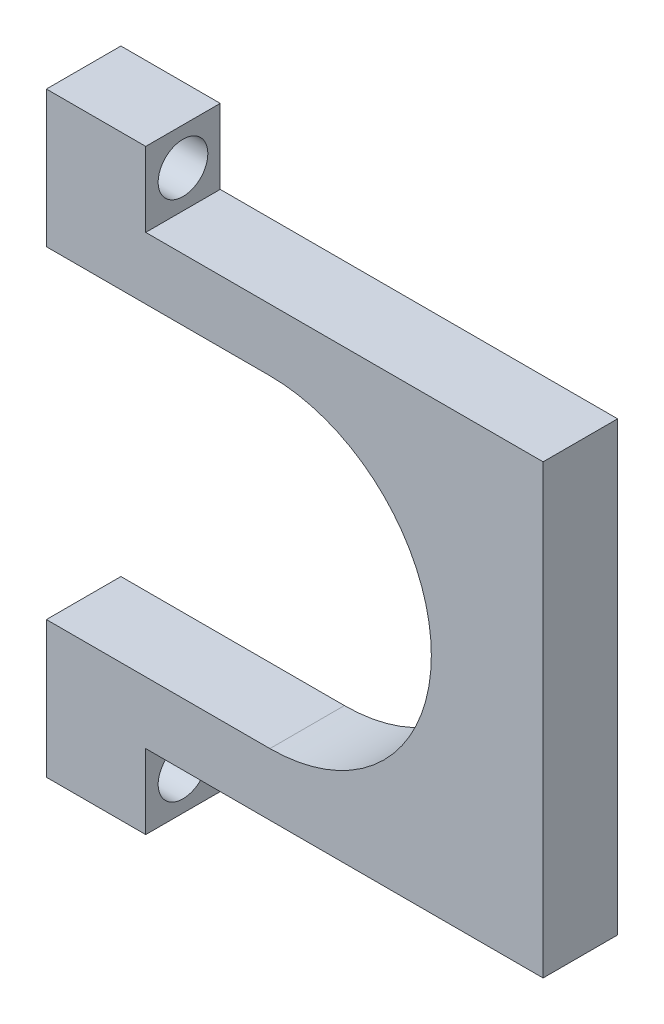
ISO-10303-21;
HEADER;
FILE_DESCRIPTION(('STEP AP214'),'2;1');
FILE_NAME('part.step','',(''),(''),'','','');
FILE_SCHEMA(('AUTOMOTIVE_DESIGN { 1 0 10303 214 1 1 1 1 }'));
ENDSEC;
DATA;
#1=APPLICATION_CONTEXT('core data for automotive mechanical design processes');
#2=APPLICATION_PROTOCOL_DEFINITION('international standard','automotive_design',2000,#1);
#3=PRODUCT_CONTEXT('',#1,'mechanical');
#4=PRODUCT('Part','Part','',(#3));
#5=PRODUCT_RELATED_PRODUCT_CATEGORY('part','',(#4));
#6=PRODUCT_DEFINITION_FORMATION('','',#4);
#7=PRODUCT_DEFINITION_CONTEXT('part definition',#1,'design');
#8=PRODUCT_DEFINITION('design','',#6,#7);
#9=PRODUCT_DEFINITION_SHAPE('','',#8);
#10=(LENGTH_UNIT() NAMED_UNIT(*) SI_UNIT(.MILLI.,.METRE.));
#11=(NAMED_UNIT(*) PLANE_ANGLE_UNIT() SI_UNIT($,.RADIAN.));
#12=(NAMED_UNIT(*) SI_UNIT($,.STERADIAN.) SOLID_ANGLE_UNIT());
#13=UNCERTAINTY_MEASURE_WITH_UNIT(LENGTH_MEASURE(1.E-05),#10,'distance_accuracy_value','');
#14=(GEOMETRIC_REPRESENTATION_CONTEXT(3) GLOBAL_UNCERTAINTY_ASSIGNED_CONTEXT((#13)) GLOBAL_UNIT_ASSIGNED_CONTEXT((#10,
#11,#12)) REPRESENTATION_CONTEXT('',''));
#15=CARTESIAN_POINT('',(0.,0.,0.));
#16=DIRECTION('',(0.,0.,1.));
#17=DIRECTION('',(1.,0.,0.));
#18=AXIS2_PLACEMENT_3D('',#15,#16,#17);
#19=CARTESIAN_POINT('',(-11.5569823434992,5.6661316211878,-3.));
#20=DIRECTION('',(-1.,0.,0.));
#21=DIRECTION('',(0.,0.,1.));
#22=AXIS2_PLACEMENT_3D('',#19,#20,#21);
#23=PLANE('',#22);
#24=CARTESIAN_POINT('',(-11.5569823434992,7.1661316211878,-1.5));
#25=DIRECTION('',(1.,0.,0.));
#26=DIRECTION('',(0.,0.,-1.));
#27=AXIS2_PLACEMENT_3D('',#24,#25,#26);
#28=CIRCLE('',#27,1.);
#29=CARTESIAN_POINT('',(-11.5569823434992,7.1661316211878,-2.5));
#30=VERTEX_POINT('',#29);
#31=EDGE_CURVE('E150',#30,#30,#28,.T.);
#32=ORIENTED_EDGE('',*,*,#31,.T.);
#33=EDGE_LOOP('',(#32));
#34=FACE_BOUND('',#33,.T.);
#35=DIRECTION('',(0.,-1.,0.));
#36=VECTOR('',#35,1.);
#37=CARTESIAN_POINT('',(-11.5569823434992,5.6661316211878,0.));
#38=LINE('',#37,#36);
#39=CARTESIAN_POINT('',(-11.5569823434992,8.6661316211878,0.));
#40=VERTEX_POINT('',#39);
#41=CARTESIAN_POINT('',(-11.5569823434992,3.1661316211878,0.));
#42=VERTEX_POINT('',#41);
#43=EDGE_CURVE('E207',#40,#42,#38,.T.);
#44=ORIENTED_EDGE('',*,*,#43,.F.);
#45=DIRECTION('',(0.,0.,1.));
#46=VECTOR('',#45,1.);
#47=CARTESIAN_POINT('',(-11.5569823434992,8.6661316211878,-3.));
#48=LINE('',#47,#46);
#49=CARTESIAN_POINT('',(-11.5569823434992,8.6661316211878,-3.));
#50=VERTEX_POINT('',#49);
#51=EDGE_CURVE('E161',#50,#40,#48,.T.);
#52=ORIENTED_EDGE('',*,*,#51,.F.);
#53=DIRECTION('',(0.,-1.,0.));
#54=VECTOR('',#53,1.);
#55=CARTESIAN_POINT('',(-11.5569823434992,5.6661316211878,-3.));
#56=LINE('',#55,#54);
#57=CARTESIAN_POINT('',(-11.5569823434992,3.1661316211878,-3.));
#58=VERTEX_POINT('',#57);
#59=EDGE_CURVE('E191',#50,#58,#56,.T.);
#60=ORIENTED_EDGE('',*,*,#59,.T.);
#61=DIRECTION('',(0.,0.,1.));
#62=VECTOR('',#61,1.);
#63=CARTESIAN_POINT('',(-11.5569823434992,3.1661316211878,-3.));
#64=LINE('',#63,#62);
#65=EDGE_CURVE('E248',#58,#42,#64,.T.);
#66=ORIENTED_EDGE('',*,*,#65,.T.);
#67=EDGE_LOOP('',(#44,#52,#60,#66));
#68=FACE_BOUND('',#67,.T.);
#69=ADVANCED_FACE('F33',(#34,#68),#23,.T.);
#70=CARTESIAN_POINT('',(-11.5569823434992,5.6661316211878,-3.));
#71=DIRECTION('',(0.,1.,0.));
#72=DIRECTION('',(0.,0.,1.));
#73=AXIS2_PLACEMENT_3D('',#70,#71,#72);
#74=PLANE('',#73);
#75=DIRECTION('',(0.,0.,-1.));
#76=VECTOR('',#75,1.);
#77=CARTESIAN_POINT('',(-7.55698234349919,5.6661316211878,-3.));
#78=LINE('',#77,#76);
#79=CARTESIAN_POINT('',(-7.55698234349919,5.6661316211878,0.));
#80=VERTEX_POINT('',#79);
#81=CARTESIAN_POINT('',(-7.55698234349919,5.6661316211878,-3.));
#82=VERTEX_POINT('',#81);
#83=EDGE_CURVE('E57',#80,#82,#78,.T.);
#84=ORIENTED_EDGE('',*,*,#83,.F.);
#85=DIRECTION('',(-1.,0.,0.));
#86=VECTOR('',#85,1.);
#87=CARTESIAN_POINT('',(-11.5569823434992,5.6661316211878,0.));
#88=LINE('',#87,#86);
#89=CARTESIAN_POINT('',(8.44301765650081,5.6661316211878,0.));
#90=VERTEX_POINT('',#89);
#91=EDGE_CURVE('E195',#90,#80,#88,.T.);
#92=ORIENTED_EDGE('',*,*,#91,.F.);
#93=DIRECTION('',(0.,0.,1.));
#94=VECTOR('',#93,1.);
#95=CARTESIAN_POINT('',(8.44301765650081,5.6661316211878,-3.));
#96=LINE('',#95,#94);
#97=CARTESIAN_POINT('',(8.44301765650081,5.6661316211878,-3.));
#98=VERTEX_POINT('',#97);
#99=EDGE_CURVE('E11',#98,#90,#96,.T.);
#100=ORIENTED_EDGE('',*,*,#99,.F.);
#101=DIRECTION('',(-1.,0.,0.));
#102=VECTOR('',#101,1.);
#103=CARTESIAN_POINT('',(-11.5569823434992,5.6661316211878,-3.));
#104=LINE('',#103,#102);
#105=EDGE_CURVE('E181',#98,#82,#104,.T.);
#106=ORIENTED_EDGE('',*,*,#105,.T.);
#107=EDGE_LOOP('',(#84,#92,#100,#106));
#108=FACE_BOUND('',#107,.T.);
#109=ADVANCED_FACE('F277',(#108),#74,.T.);
#110=CARTESIAN_POINT('',(8.44301765650081,5.6661316211878,-3.));
#111=DIRECTION('',(1.,0.,0.));
#112=DIRECTION('',(0.,1.,0.));
#113=AXIS2_PLACEMENT_3D('',#110,#111,#112);
#114=PLANE('',#113);
#115=DIRECTION('',(0.,1.,0.));
#116=VECTOR('',#115,1.);
#117=CARTESIAN_POINT('',(8.44301765650081,5.6661316211878,0.));
#118=LINE('',#117,#116);
#119=CARTESIAN_POINT('',(8.44301765650081,-12.3338683788122,0.));
#120=VERTEX_POINT('',#119);
#121=EDGE_CURVE('E225',#120,#90,#118,.T.);
#122=ORIENTED_EDGE('',*,*,#121,.F.);
#123=DIRECTION('',(0.,0.,1.));
#124=VECTOR('',#123,1.);
#125=CARTESIAN_POINT('',(8.44301765650081,-12.3338683788122,-3.));
#126=LINE('',#125,#124);
#127=CARTESIAN_POINT('',(8.44301765650081,-12.3338683788122,-3.));
#128=VERTEX_POINT('',#127);
#129=EDGE_CURVE('E41',#128,#120,#126,.T.);
#130=ORIENTED_EDGE('',*,*,#129,.F.);
#131=DIRECTION('',(0.,1.,0.));
#132=VECTOR('',#131,1.);
#133=CARTESIAN_POINT('',(8.44301765650081,5.6661316211878,-3.));
#134=LINE('',#133,#132);
#135=EDGE_CURVE('E203',#128,#98,#134,.T.);
#136=ORIENTED_EDGE('',*,*,#135,.T.);
#137=ORIENTED_EDGE('',*,*,#99,.T.);
#138=EDGE_LOOP('',(#122,#130,#136,#137));
#139=FACE_BOUND('',#138,.T.);
#140=ADVANCED_FACE('F282',(#139),#114,.T.);
#141=CARTESIAN_POINT('',(-11.5569823434992,-12.3338683788122,-3.));
#142=DIRECTION('',(0.,-1.,0.));
#143=DIRECTION('',(0.,0.,-1.));
#144=AXIS2_PLACEMENT_3D('',#141,#142,#143);
#145=PLANE('',#144);
#146=DIRECTION('',(0.,0.,1.));
#147=VECTOR('',#146,1.);
#148=CARTESIAN_POINT('',(-7.55698234349919,-12.3338683788122,0.));
#149=LINE('',#148,#147);
#150=CARTESIAN_POINT('',(-7.55698234349919,-12.3338683788122,-3.));
#151=VERTEX_POINT('',#150);
#152=CARTESIAN_POINT('',(-7.55698234349919,-12.3338683788122,0.));
#153=VERTEX_POINT('',#152);
#154=EDGE_CURVE('E49',#151,#153,#149,.T.);
#155=ORIENTED_EDGE('',*,*,#154,.F.);
#156=DIRECTION('',(1.,0.,0.));
#157=VECTOR('',#156,1.);
#158=CARTESIAN_POINT('',(-11.5569823434992,-12.3338683788122,-3.));
#159=LINE('',#158,#157);
#160=EDGE_CURVE('E133',#151,#128,#159,.T.);
#161=ORIENTED_EDGE('',*,*,#160,.T.);
#162=ORIENTED_EDGE('',*,*,#129,.T.);
#163=DIRECTION('',(1.,0.,0.));
#164=VECTOR('',#163,1.);
#165=CARTESIAN_POINT('',(-11.5569823434992,-12.3338683788122,0.));
#166=LINE('',#165,#164);
#167=EDGE_CURVE('E222',#153,#120,#166,.T.);
#168=ORIENTED_EDGE('',*,*,#167,.F.);
#169=EDGE_LOOP('',(#155,#161,#162,#168));
#170=FACE_BOUND('',#169,.T.);
#171=ADVANCED_FACE('F321',(#170),#145,.T.);
#172=CARTESIAN_POINT('',(-11.5569823434992,-9.8338683788122,-3.));
#173=DIRECTION('',(-1.,0.,0.));
#174=DIRECTION('',(0.,0.,1.));
#175=AXIS2_PLACEMENT_3D('',#172,#173,#174);
#176=PLANE('',#175);
#177=CARTESIAN_POINT('',(-11.5569823434992,-13.8338683788122,-1.5));
#178=DIRECTION('',(1.,0.,0.));
#179=DIRECTION('',(0.,0.,-1.));
#180=AXIS2_PLACEMENT_3D('',#177,#178,#179);
#181=CIRCLE('',#180,1.);
#182=CARTESIAN_POINT('',(-11.5569823434992,-13.8338683788122,-2.5));
#183=VERTEX_POINT('',#182);
#184=EDGE_CURVE('E288',#183,#183,#181,.T.);
#185=ORIENTED_EDGE('',*,*,#184,.T.);
#186=EDGE_LOOP('',(#185));
#187=FACE_BOUND('',#186,.T.);
#188=DIRECTION('',(0.,-1.,0.));
#189=VECTOR('',#188,1.);
#190=CARTESIAN_POINT('',(-11.5569823434992,-9.8338683788122,0.));
#191=LINE('',#190,#189);
#192=CARTESIAN_POINT('',(-11.5569823434992,-9.8338683788122,0.));
#193=VERTEX_POINT('',#192);
#194=CARTESIAN_POINT('',(-11.5569823434992,-15.3338683788122,0.));
#195=VERTEX_POINT('',#194);
#196=EDGE_CURVE('E220',#193,#195,#191,.T.);
#197=ORIENTED_EDGE('',*,*,#196,.F.);
#198=DIRECTION('',(0.,0.,1.));
#199=VECTOR('',#198,1.);
#200=CARTESIAN_POINT('',(-11.5569823434992,-9.8338683788122,-3.));
#201=LINE('',#200,#199);
#202=CARTESIAN_POINT('',(-11.5569823434992,-9.8338683788122,-3.));
#203=VERTEX_POINT('',#202);
#204=EDGE_CURVE('E129',#203,#193,#201,.T.);
#205=ORIENTED_EDGE('',*,*,#204,.F.);
#206=DIRECTION('',(0.,-1.,0.));
#207=VECTOR('',#206,1.);
#208=CARTESIAN_POINT('',(-11.5569823434992,-9.8338683788122,-3.));
#209=LINE('',#208,#207);
#210=CARTESIAN_POINT('',(-11.5569823434992,-15.3338683788122,-3.));
#211=VERTEX_POINT('',#210);
#212=EDGE_CURVE('E123',#203,#211,#209,.T.);
#213=ORIENTED_EDGE('',*,*,#212,.T.);
#214=DIRECTION('',(0.,0.,-1.));
#215=VECTOR('',#214,1.);
#216=CARTESIAN_POINT('',(-11.5569823434992,-15.3338683788122,0.));
#217=LINE('',#216,#215);
#218=EDGE_CURVE('E128',#195,#211,#217,.T.);
#219=ORIENTED_EDGE('',*,*,#218,.F.);
#220=EDGE_LOOP('',(#197,#205,#213,#219));
#221=FACE_BOUND('',#220,.T.);
#222=ADVANCED_FACE('F126',(#187,#221),#176,.T.);
#223=CARTESIAN_POINT('',(-2.55698234349919,-9.8338683788122,-3.));
#224=DIRECTION('',(0.,1.,0.));
#225=DIRECTION('',(-1.,0.,0.));
#226=AXIS2_PLACEMENT_3D('',#223,#224,#225);
#227=PLANE('',#226);
#228=DIRECTION('',(-1.,0.,0.));
#229=VECTOR('',#228,1.);
#230=CARTESIAN_POINT('',(-2.55698234349919,-9.8338683788122,0.));
#231=LINE('',#230,#229);
#232=CARTESIAN_POINT('',(-2.55698234349919,-9.8338683788122,0.));
#233=VERTEX_POINT('',#232);
#234=EDGE_CURVE('E217',#233,#193,#231,.T.);
#235=ORIENTED_EDGE('',*,*,#234,.F.);
#236=DIRECTION('',(0.,0.,1.));
#237=VECTOR('',#236,1.);
#238=CARTESIAN_POINT('',(-2.55698234349919,-9.8338683788122,-3.));
#239=LINE('',#238,#237);
#240=CARTESIAN_POINT('',(-2.55698234349919,-9.8338683788122,-3.));
#241=VERTEX_POINT('',#240);
#242=EDGE_CURVE('E255',#241,#233,#239,.T.);
#243=ORIENTED_EDGE('',*,*,#242,.F.);
#244=DIRECTION('',(-1.,0.,0.));
#245=VECTOR('',#244,1.);
#246=CARTESIAN_POINT('',(-2.55698234349919,-9.8338683788122,-3.));
#247=LINE('',#246,#245);
#248=EDGE_CURVE('E134',#241,#203,#247,.T.);
#249=ORIENTED_EDGE('',*,*,#248,.T.);
#250=ORIENTED_EDGE('',*,*,#204,.T.);
#251=EDGE_LOOP('',(#235,#243,#249,#250));
#252=FACE_BOUND('',#251,.T.);
#253=ADVANCED_FACE('F261',(#252),#227,.T.);
#254=CARTESIAN_POINT('',(-2.55698234349919,-3.3338683788122,-3.));
#255=DIRECTION('',(0.,0.,1.));
#256=DIRECTION('',(1.,0.,0.));
#257=AXIS2_PLACEMENT_3D('',#254,#255,#256);
#258=CYLINDRICAL_SURFACE('',#257,6.5);
#259=CARTESIAN_POINT('',(-2.55698234349919,-3.3338683788122,0.));
#260=DIRECTION('',(0.,0.,-1.));
#261=DIRECTION('',(1.,0.,0.));
#262=AXIS2_PLACEMENT_3D('',#259,#260,#261);
#263=CIRCLE('',#262,6.5);
#264=CARTESIAN_POINT('',(-2.55698234349919,3.1661316211878,0.));
#265=VERTEX_POINT('',#264);
#266=EDGE_CURVE('E214',#265,#233,#263,.T.);
#267=ORIENTED_EDGE('',*,*,#266,.F.);
#268=DIRECTION('',(0.,0.,1.));
#269=VECTOR('',#268,1.);
#270=CARTESIAN_POINT('',(-2.55698234349919,3.1661316211878,-3.));
#271=LINE('',#270,#269);
#272=CARTESIAN_POINT('',(-2.55698234349919,3.1661316211878,-3.));
#273=VERTEX_POINT('',#272);
#274=EDGE_CURVE('E253',#273,#265,#271,.T.);
#275=ORIENTED_EDGE('',*,*,#274,.F.);
#276=CARTESIAN_POINT('',(-2.55698234349919,-3.3338683788122,-3.));
#277=DIRECTION('',(0.,0.,-1.));
#278=DIRECTION('',(1.,0.,0.));
#279=AXIS2_PLACEMENT_3D('',#276,#277,#278);
#280=CIRCLE('',#279,6.5);
#281=EDGE_CURVE('E198',#273,#241,#280,.T.);
#282=ORIENTED_EDGE('',*,*,#281,.T.);
#283=ORIENTED_EDGE('',*,*,#242,.T.);
#284=EDGE_LOOP('',(#267,#275,#282,#283));
#285=FACE_BOUND('',#284,.T.);
#286=ADVANCED_FACE('F257',(#285),#258,.F.);
#287=CARTESIAN_POINT('',(-11.5569823434992,3.1661316211878,-3.));
#288=DIRECTION('',(0.,-1.,0.));
#289=DIRECTION('',(0.,0.,-1.));
#290=AXIS2_PLACEMENT_3D('',#287,#288,#289);
#291=PLANE('',#290);
#292=DIRECTION('',(1.,0.,0.));
#293=VECTOR('',#292,1.);
#294=CARTESIAN_POINT('',(-11.5569823434992,3.1661316211878,0.));
#295=LINE('',#294,#293);
#296=EDGE_CURVE('E210',#42,#265,#295,.T.);
#297=ORIENTED_EDGE('',*,*,#296,.F.);
#298=ORIENTED_EDGE('',*,*,#65,.F.);
#299=DIRECTION('',(1.,0.,0.));
#300=VECTOR('',#299,1.);
#301=CARTESIAN_POINT('',(-11.5569823434992,3.1661316211878,-3.));
#302=LINE('',#301,#300);
#303=EDGE_CURVE('E194',#58,#273,#302,.T.);
#304=ORIENTED_EDGE('',*,*,#303,.T.);
#305=ORIENTED_EDGE('',*,*,#274,.T.);
#306=EDGE_LOOP('',(#297,#298,#304,#305));
#307=FACE_BOUND('',#306,.T.);
#308=ADVANCED_FACE('F252',(#307),#291,.T.);
#309=CARTESIAN_POINT('',(-2.55698234349919,-3.3338683788122,-3.));
#310=DIRECTION('',(0.,0.,1.));
#311=DIRECTION('',(1.,0.,0.));
#312=AXIS2_PLACEMENT_3D('',#309,#310,#311);
#313=PLANE('',#312);
#314=ORIENTED_EDGE('',*,*,#59,.F.);
#315=DIRECTION('',(-1.,0.,0.));
#316=VECTOR('',#315,1.);
#317=CARTESIAN_POINT('',(-11.5569823434992,8.6661316211878,-3.));
#318=LINE('',#317,#316);
#319=CARTESIAN_POINT('',(-7.55698234349919,8.6661316211878,-3.));
#320=VERTEX_POINT('',#319);
#321=EDGE_CURVE('E189',#320,#50,#318,.T.);
#322=ORIENTED_EDGE('',*,*,#321,.F.);
#323=DIRECTION('',(0.,-1.,0.));
#324=VECTOR('',#323,1.);
#325=CARTESIAN_POINT('',(-7.55698234349919,8.6661316211878,-3.));
#326=LINE('',#325,#324);
#327=EDGE_CURVE('E184',#320,#82,#326,.T.);
#328=ORIENTED_EDGE('',*,*,#327,.T.);
#329=ORIENTED_EDGE('',*,*,#105,.F.);
#330=ORIENTED_EDGE('',*,*,#135,.F.);
#331=ORIENTED_EDGE('',*,*,#160,.F.);
#332=DIRECTION('',(0.,1.,0.));
#333=VECTOR('',#332,1.);
#334=CARTESIAN_POINT('',(-7.55698234349919,-15.3338683788122,-3.));
#335=LINE('',#334,#333);
#336=CARTESIAN_POINT('',(-7.55698234349919,-15.3338683788122,-3.));
#337=VERTEX_POINT('',#336);
#338=EDGE_CURVE('E140',#337,#151,#335,.T.);
#339=ORIENTED_EDGE('',*,*,#338,.F.);
#340=DIRECTION('',(1.,0.,0.));
#341=VECTOR('',#340,1.);
#342=CARTESIAN_POINT('',(-11.5569823434992,-15.3338683788122,-3.));
#343=LINE('',#342,#341);
#344=EDGE_CURVE('E137',#211,#337,#343,.T.);
#345=ORIENTED_EDGE('',*,*,#344,.F.);
#346=ORIENTED_EDGE('',*,*,#212,.F.);
#347=ORIENTED_EDGE('',*,*,#248,.F.);
#348=ORIENTED_EDGE('',*,*,#281,.F.);
#349=ORIENTED_EDGE('',*,*,#303,.F.);
#350=EDGE_LOOP('',(#314,#322,#328,#329,#330,#331,#339,#345,#346,#347,#348,#349));
#351=FACE_BOUND('',#350,.T.);
#352=ADVANCED_FACE('F138',(#351),#313,.F.);
#353=CARTESIAN_POINT('',(-2.55698234349919,-3.3338683788122,0.));
#354=DIRECTION('',(0.,0.,1.));
#355=DIRECTION('',(1.,0.,0.));
#356=AXIS2_PLACEMENT_3D('',#353,#354,#355);
#357=PLANE('',#356);
#358=ORIENTED_EDGE('',*,*,#43,.T.);
#359=ORIENTED_EDGE('',*,*,#296,.T.);
#360=ORIENTED_EDGE('',*,*,#266,.T.);
#361=ORIENTED_EDGE('',*,*,#234,.T.);
#362=ORIENTED_EDGE('',*,*,#196,.T.);
#363=DIRECTION('',(-1.,0.,0.));
#364=VECTOR('',#363,1.);
#365=CARTESIAN_POINT('',(-11.5569823434992,-15.3338683788122,0.));
#366=LINE('',#365,#364);
#367=CARTESIAN_POINT('',(-7.55698234349919,-15.3338683788122,0.));
#368=VERTEX_POINT('',#367);
#369=EDGE_CURVE('E148',#368,#195,#366,.T.);
#370=ORIENTED_EDGE('',*,*,#369,.F.);
#371=DIRECTION('',(0.,1.,0.));
#372=VECTOR('',#371,1.);
#373=CARTESIAN_POINT('',(-7.55698234349919,-15.3338683788122,0.));
#374=LINE('',#373,#372);
#375=EDGE_CURVE('E158',#368,#153,#374,.T.);
#376=ORIENTED_EDGE('',*,*,#375,.T.);
#377=ORIENTED_EDGE('',*,*,#167,.T.);
#378=ORIENTED_EDGE('',*,*,#121,.T.);
#379=ORIENTED_EDGE('',*,*,#91,.T.);
#380=DIRECTION('',(0.,-1.,0.));
#381=VECTOR('',#380,1.);
#382=CARTESIAN_POINT('',(-7.55698234349919,8.6661316211878,0.));
#383=LINE('',#382,#381);
#384=CARTESIAN_POINT('',(-7.55698234349919,8.6661316211878,0.));
#385=VERTEX_POINT('',#384);
#386=EDGE_CURVE('E211',#385,#80,#383,.T.);
#387=ORIENTED_EDGE('',*,*,#386,.F.);
#388=DIRECTION('',(1.,0.,0.));
#389=VECTOR('',#388,1.);
#390=CARTESIAN_POINT('',(-11.5569823434992,8.6661316211878,0.));
#391=LINE('',#390,#389);
#392=EDGE_CURVE('E177',#40,#385,#391,.T.);
#393=ORIENTED_EDGE('',*,*,#392,.F.);
#394=EDGE_LOOP('',(#358,#359,#360,#361,#362,#370,#376,#377,#378,#379,#387,#393));
#395=FACE_BOUND('',#394,.T.);
#396=ADVANCED_FACE('F242',(#395),#357,.T.);
#397=CARTESIAN_POINT('',(-7.55698234349919,8.6661316211878,-3.));
#398=DIRECTION('',(-1.,0.,0.));
#399=DIRECTION('',(0.,0.,1.));
#400=AXIS2_PLACEMENT_3D('',#397,#398,#399);
#401=PLANE('',#400);
#402=CARTESIAN_POINT('',(-7.55698234349919,7.1661316211878,-1.5));
#403=DIRECTION('',(1.,0.,0.));
#404=DIRECTION('',(0.,0.,-1.));
#405=AXIS2_PLACEMENT_3D('',#402,#403,#404);
#406=CIRCLE('',#405,1.);
#407=CARTESIAN_POINT('',(-7.55698234349919,7.1661316211878,-2.5));
#408=VERTEX_POINT('',#407);
#409=EDGE_CURVE('E153',#408,#408,#406,.T.);
#410=ORIENTED_EDGE('',*,*,#409,.F.);
#411=EDGE_LOOP('',(#410));
#412=FACE_BOUND('',#411,.T.);
#413=ORIENTED_EDGE('',*,*,#83,.T.);
#414=ORIENTED_EDGE('',*,*,#327,.F.);
#415=DIRECTION('',(0.,0.,-1.));
#416=VECTOR('',#415,1.);
#417=CARTESIAN_POINT('',(-7.55698234349919,8.6661316211878,-3.));
#418=LINE('',#417,#416);
#419=EDGE_CURVE('E236',#385,#320,#418,.T.);
#420=ORIENTED_EDGE('',*,*,#419,.F.);
#421=ORIENTED_EDGE('',*,*,#386,.T.);
#422=EDGE_LOOP('',(#413,#414,#420,#421));
#423=FACE_BOUND('',#422,.T.);
#424=ADVANCED_FACE('F244',(#412,#423),#401,.F.);
#425=CARTESIAN_POINT('',(0.,8.6661316211878,0.));
#426=DIRECTION('',(0.,1.,0.));
#427=DIRECTION('',(0.,0.,1.));
#428=AXIS2_PLACEMENT_3D('',#425,#426,#427);
#429=PLANE('',#428);
#430=ORIENTED_EDGE('',*,*,#51,.T.);
#431=ORIENTED_EDGE('',*,*,#392,.T.);
#432=ORIENTED_EDGE('',*,*,#419,.T.);
#433=ORIENTED_EDGE('',*,*,#321,.T.);
#434=EDGE_LOOP('',(#430,#431,#432,#433));
#435=FACE_BOUND('',#434,.T.);
#436=ADVANCED_FACE('F240',(#435),#429,.T.);
#437=CARTESIAN_POINT('',(-7.55698234349919,-15.3338683788122,0.));
#438=DIRECTION('',(-1.,0.,0.));
#439=DIRECTION('',(0.,0.,1.));
#440=AXIS2_PLACEMENT_3D('',#437,#438,#439);
#441=PLANE('',#440);
#442=CARTESIAN_POINT('',(-7.55698234349919,-13.8338683788122,-1.5));
#443=DIRECTION('',(1.,0.,0.));
#444=DIRECTION('',(0.,0.,-1.));
#445=AXIS2_PLACEMENT_3D('',#442,#443,#444);
#446=CIRCLE('',#445,1.);
#447=CARTESIAN_POINT('',(-7.55698234349919,-13.8338683788122,-2.5));
#448=VERTEX_POINT('',#447);
#449=EDGE_CURVE('E290',#448,#448,#446,.T.);
#450=ORIENTED_EDGE('',*,*,#449,.F.);
#451=EDGE_LOOP('',(#450));
#452=FACE_BOUND('',#451,.T.);
#453=ORIENTED_EDGE('',*,*,#154,.T.);
#454=ORIENTED_EDGE('',*,*,#375,.F.);
#455=DIRECTION('',(0.,0.,1.));
#456=VECTOR('',#455,1.);
#457=CARTESIAN_POINT('',(-7.55698234349919,-15.3338683788122,0.));
#458=LINE('',#457,#456);
#459=EDGE_CURVE('E143',#337,#368,#458,.T.);
#460=ORIENTED_EDGE('',*,*,#459,.F.);
#461=ORIENTED_EDGE('',*,*,#338,.T.);
#462=EDGE_LOOP('',(#453,#454,#460,#461));
#463=FACE_BOUND('',#462,.T.);
#464=ADVANCED_FACE('F264',(#452,#463),#441,.F.);
#465=CARTESIAN_POINT('',(0.,-15.3338683788122,0.));
#466=DIRECTION('',(0.,-1.,0.));
#467=DIRECTION('',(0.,0.,-1.));
#468=AXIS2_PLACEMENT_3D('',#465,#466,#467);
#469=PLANE('',#468);
#470=ORIENTED_EDGE('',*,*,#218,.T.);
#471=ORIENTED_EDGE('',*,*,#344,.T.);
#472=ORIENTED_EDGE('',*,*,#459,.T.);
#473=ORIENTED_EDGE('',*,*,#369,.T.);
#474=EDGE_LOOP('',(#470,#471,#472,#473));
#475=FACE_BOUND('',#474,.T.);
#476=ADVANCED_FACE('F146',(#475),#469,.T.);
#477=CARTESIAN_POINT('',(-11.5569823434992,7.1661316211878,-1.5));
#478=DIRECTION('',(1.,0.,0.));
#479=DIRECTION('',(0.,0.,-1.));
#480=AXIS2_PLACEMENT_3D('',#477,#478,#479);
#481=CYLINDRICAL_SURFACE('',#480,1.);
#482=ORIENTED_EDGE('',*,*,#31,.F.);
#483=EDGE_LOOP('',(#482));
#484=FACE_BOUND('',#483,.T.);
#485=ORIENTED_EDGE('',*,*,#409,.T.);
#486=EDGE_LOOP('',(#485));
#487=FACE_BOUND('',#486,.T.);
#488=ADVANCED_FACE('F272',(#484,#487),#481,.F.);
#489=CARTESIAN_POINT('',(-11.5569823434992,-13.8338683788122,-1.5));
#490=DIRECTION('',(1.,0.,0.));
#491=DIRECTION('',(0.,0.,-1.));
#492=AXIS2_PLACEMENT_3D('',#489,#490,#491);
#493=CYLINDRICAL_SURFACE('',#492,1.);
#494=ORIENTED_EDGE('',*,*,#184,.F.);
#495=EDGE_LOOP('',(#494));
#496=FACE_BOUND('',#495,.T.);
#497=ORIENTED_EDGE('',*,*,#449,.T.);
#498=EDGE_LOOP('',(#497));
#499=FACE_BOUND('',#498,.T.);
#500=ADVANCED_FACE('F297',(#496,#499),#493,.F.);
#501=CLOSED_SHELL('',(#69,#109,#140,#171,#222,#253,#286,#308,#352,#396,#424,#436,#464,#476,#488,#500));
#502=MANIFOLD_SOLID_BREP('B2',#501);
#503=ADVANCED_BREP_SHAPE_REPRESENTATION('',(#18,#502),#14);
#504=SHAPE_DEFINITION_REPRESENTATION(#9,#503);
ENDSEC;
END-ISO-10303-21;
